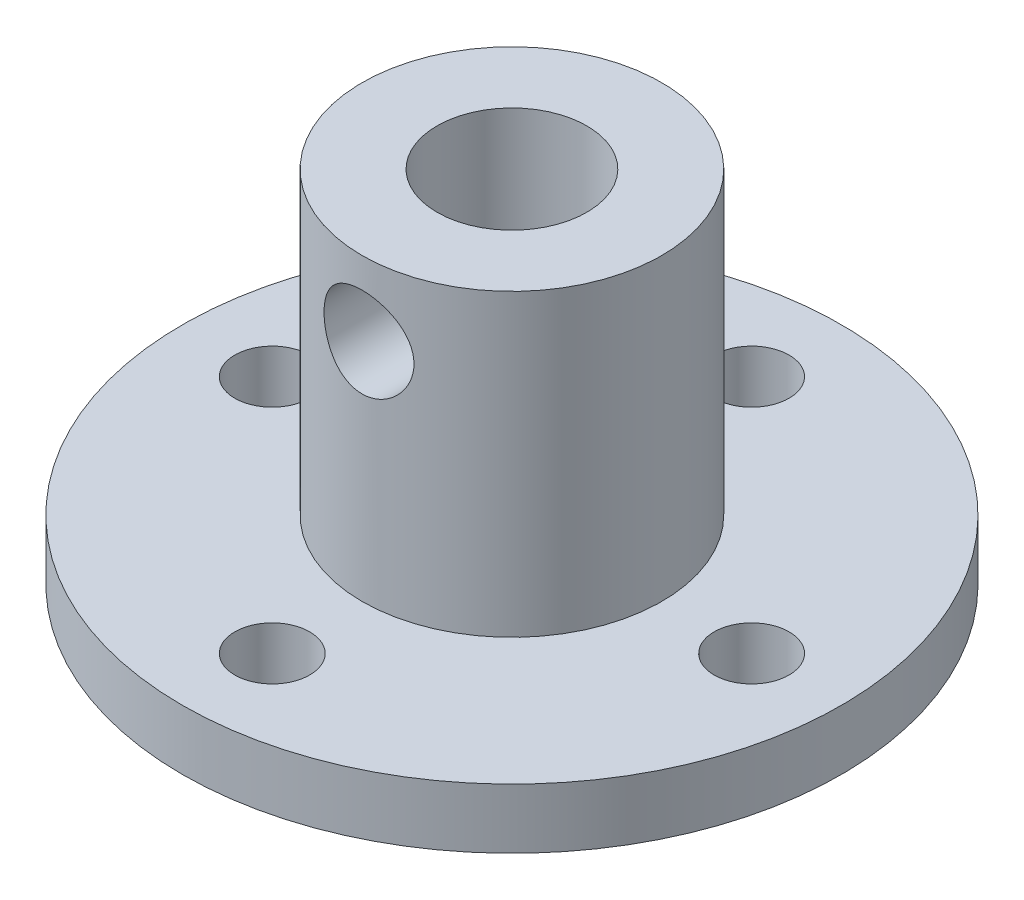
ISO-10303-21;
HEADER;
FILE_DESCRIPTION(('STEP AP214'),'2;1');
FILE_NAME('part.step','',(''),(''),'','','');
FILE_SCHEMA(('AUTOMOTIVE_DESIGN { 1 0 10303 214 1 1 1 1 }'));
ENDSEC;
DATA;
#1=APPLICATION_CONTEXT('core data for automotive mechanical design processes');
#2=APPLICATION_PROTOCOL_DEFINITION('international standard','automotive_design',2000,#1);
#3=PRODUCT_CONTEXT('',#1,'mechanical');
#4=PRODUCT('Part','Part','',(#3));
#5=PRODUCT_RELATED_PRODUCT_CATEGORY('part','',(#4));
#6=PRODUCT_DEFINITION_FORMATION('','',#4);
#7=PRODUCT_DEFINITION_CONTEXT('part definition',#1,'design');
#8=PRODUCT_DEFINITION('design','',#6,#7);
#9=PRODUCT_DEFINITION_SHAPE('','',#8);
#10=(LENGTH_UNIT() NAMED_UNIT(*) SI_UNIT(.MILLI.,.METRE.));
#11=(NAMED_UNIT(*) PLANE_ANGLE_UNIT() SI_UNIT($,.RADIAN.));
#12=(NAMED_UNIT(*) SI_UNIT($,.STERADIAN.) SOLID_ANGLE_UNIT());
#13=UNCERTAINTY_MEASURE_WITH_UNIT(LENGTH_MEASURE(1.E-05),#10,'distance_accuracy_value','');
#14=(GEOMETRIC_REPRESENTATION_CONTEXT(3) GLOBAL_UNCERTAINTY_ASSIGNED_CONTEXT((#13)) GLOBAL_UNIT_ASSIGNED_CONTEXT((#10,
#11,#12)) REPRESENTATION_CONTEXT('',''));
#15=CARTESIAN_POINT('',(0.,0.,0.));
#16=DIRECTION('',(0.,0.,1.));
#17=DIRECTION('',(1.,0.,0.));
#18=AXIS2_PLACEMENT_3D('',#15,#16,#17);
#19=CARTESIAN_POINT('',(0.,12.,0.));
#20=DIRECTION('',(0.,-1.,0.));
#21=DIRECTION('',(0.,0.,-1.));
#22=AXIS2_PLACEMENT_3D('',#19,#20,#21);
#23=CYLINDRICAL_SURFACE('',#22,5.);
#24=CARTESIAN_POINT('',(0.,12.,0.));
#25=DIRECTION('',(0.,1.,0.));
#26=DIRECTION('',(0.,0.,1.));
#27=AXIS2_PLACEMENT_3D('',#24,#25,#26);
#28=CIRCLE('',#27,5.);
#29=CARTESIAN_POINT('',(0.,12.,5.));
#30=VERTEX_POINT('',#29);
#31=EDGE_CURVE('E47',#30,#30,#28,.T.);
#32=ORIENTED_EDGE('',*,*,#31,.F.);
#33=EDGE_LOOP('',(#32));
#34=FACE_BOUND('',#33,.T.);
#35=CARTESIAN_POINT('',(0.,2.,0.));
#36=DIRECTION('',(0.,1.,0.));
#37=DIRECTION('',(0.,0.,1.));
#38=AXIS2_PLACEMENT_3D('',#35,#36,#37);
#39=CIRCLE('',#38,5.);
#40=CARTESIAN_POINT('',(0.,2.,5.));
#41=VERTEX_POINT('',#40);
#42=EDGE_CURVE('E10',#41,#41,#39,.T.);
#43=ORIENTED_EDGE('',*,*,#42,.T.);
#44=EDGE_LOOP('',(#43));
#45=FACE_BOUND('',#44,.T.);
#46=CARTESIAN_POINT('',(-1.5,9.5,4.76969600708473));
#47=CARTESIAN_POINT('',(-1.49999897633764,9.5821945479424,4.7696968572698));
#48=CARTESIAN_POINT('',(-1.49322108167142,9.66439922414402,4.77184390209069));
#49=CARTESIAN_POINT('',(-1.46635844446749,9.82640524959194,4.780165783029));
#50=CARTESIAN_POINT('',(-1.44626925573578,9.90620578650146,4.78634196493468));
#51=CARTESIAN_POINT('',(-1.39352753269955,10.0610347282717,4.80196102485633));
#52=CARTESIAN_POINT('',(-1.36089589394243,10.1360708296331,4.81139846703232));
#53=CARTESIAN_POINT('',(-1.28406421917929,10.2796219339953,4.83246932547567));
#54=CARTESIAN_POINT('',(-1.23986245137053,10.3481359586844,4.84410307041019));
#55=CARTESIAN_POINT('',(-1.13964754141627,10.4788663905774,4.86866862185765));
#56=CARTESIAN_POINT('',(-1.08333207175807,10.5408458979463,4.88162808311636));
#57=CARTESIAN_POINT('',(-0.961136237579599,10.6546379513225,4.90714861936757));
#58=CARTESIAN_POINT('',(-0.895254645461112,10.7064491904499,4.91970964297705));
#59=CARTESIAN_POINT('',(-0.75411143779369,10.7994626998333,4.94333214579389));
#60=CARTESIAN_POINT('',(-0.678684021335815,10.8404234244428,4.95435724342404));
#61=CARTESIAN_POINT('',(-0.521624645369354,10.9089872590428,4.97334435920684));
#62=CARTESIAN_POINT('',(-0.439994028387912,10.9365932498574,4.98130703789495));
#63=CARTESIAN_POINT('',(-0.27532385263083,10.9768800010905,4.99307646003589));
#64=CARTESIAN_POINT('',(-0.192391398953801,10.9899651276527,4.99699557369338));
#65=CARTESIAN_POINT('',(-0.0254218237493156,11.0021173246464,5.00063201501348));
#66=CARTESIAN_POINT('',(0.0586150620503676,11.001187339402,5.00035022521079));
#67=CARTESIAN_POINT('',(0.222571156600159,10.985607131457,4.99569603817658));
#68=CARTESIAN_POINT('',(0.30253626764134,10.9713948061901,4.9914542020526));
#69=CARTESIAN_POINT('',(0.458889213442526,10.9303686640057,4.97951522112593));
#70=CARTESIAN_POINT('',(0.535276821322845,10.9035540490573,4.97181785750586));
#71=CARTESIAN_POINT('',(0.68334732635128,10.8377879765814,4.95365220986963));
#72=CARTESIAN_POINT('',(0.754965064694478,10.7986987971927,4.94315269676706));
#73=CARTESIAN_POINT('',(0.890764673783155,10.7096021475718,4.92049640648069));
#74=CARTESIAN_POINT('',(0.95494477487213,10.6595920870365,4.90833923637778));
#75=CARTESIAN_POINT('',(1.0766604815298,10.5478022492484,4.88311550488166));
#76=CARTESIAN_POINT('',(1.13384458040111,10.4856430809703,4.87003195321461));
#77=CARTESIAN_POINT('',(1.23707651539824,10.35248998211,4.84483979887497));
#78=CARTESIAN_POINT('',(1.28312324482852,10.2814951746108,4.8327312931702));
#79=CARTESIAN_POINT('',(1.3631399533545,10.131760530751,4.81077903197678));
#80=CARTESIAN_POINT('',(1.39698989237679,10.0529529541371,4.80095810695957));
#81=CARTESIAN_POINT('',(1.45083362878413,9.89039279155446,4.78496392548436));
#82=CARTESIAN_POINT('',(1.4708319464056,9.80664182846544,4.7787894791583));
#83=CARTESIAN_POINT('',(1.49574770282165,9.63991763926072,4.77104849541241));
#84=CARTESIAN_POINT('',(1.50119946380212,9.55703177610602,4.7693187867044));
#85=CARTESIAN_POINT('',(1.49835947233062,9.39152709999014,4.77021192441924));
#86=CARTESIAN_POINT('',(1.4900696437133,9.30890825126915,4.77283416156589));
#87=CARTESIAN_POINT('',(1.4604576357419,9.14851162202913,4.78197558554912));
#88=CARTESIAN_POINT('',(1.4394796143128,9.07066383573648,4.78839176507489));
#89=CARTESIAN_POINT('',(1.3854857774794,8.91959830918509,4.80429141231227));
#90=CARTESIAN_POINT('',(1.3524681034276,8.84638128585943,4.81377535359073));
#91=CARTESIAN_POINT('',(1.27431871196501,8.70448253592787,4.83505835023047));
#92=CARTESIAN_POINT('',(1.22888564172729,8.63597527901421,4.84691271069798));
#93=CARTESIAN_POINT('',(1.12755301600385,8.5073618938192,4.87148205646987));
#94=CARTESIAN_POINT('',(1.07165095534897,8.44725778238721,4.88419724730003));
#95=CARTESIAN_POINT('',(0.9484551324936,8.33481959418526,4.90963633548158));
#96=CARTESIAN_POINT('',(0.880811065857436,8.28286437101302,4.92234245063004));
#97=CARTESIAN_POINT('',(0.737461784590251,8.19103329897225,4.94584851748651));
#98=CARTESIAN_POINT('',(0.661756970543946,8.15115685021854,4.95664856384717));
#99=CARTESIAN_POINT('',(0.504935504705224,8.08499996943171,4.97505970474957));
#100=CARTESIAN_POINT('',(0.423864622037841,8.05861798384102,4.98269453424966));
#101=CARTESIAN_POINT('',(0.258169966504591,8.01993908110958,4.99401979596827));
#102=CARTESIAN_POINT('',(0.173547217354765,8.00763813405158,4.9977113567088));
#103=CARTESIAN_POINT('',(0.00665215388274548,7.9977769559455,5.00066544081399));
#104=CARTESIAN_POINT('',(-0.0755851790862038,7.99966730459217,5.00009305111322));
#105=CARTESIAN_POINT('',(-0.238519481164401,8.01682163249912,4.99497264465037));
#106=CARTESIAN_POINT('',(-0.319216537346526,8.03208485348044,4.99042485330463));
#107=CARTESIAN_POINT('',(-0.475935813041356,8.07521166139962,4.97791168358327));
#108=CARTESIAN_POINT('',(-0.55199892735139,8.10293818064901,4.96998352900866));
#109=CARTESIAN_POINT('',(-0.698433237752051,8.17008191450719,4.9515294303945));
#110=CARTESIAN_POINT('',(-0.768803496050577,8.20950105028619,4.94100305949946));
#111=CARTESIAN_POINT('',(-0.904301892420562,8.30037345743003,4.91803965828228));
#112=CARTESIAN_POINT('',(-0.969190250076766,8.35217143000077,4.90555226923559));
#113=CARTESIAN_POINT('',(-1.08953757134594,8.4657103883328,4.88023537212334));
#114=CARTESIAN_POINT('',(-1.14499380960193,8.52745423789815,4.86740576641079));
#115=CARTESIAN_POINT('',(-1.24656269394549,8.6613407783105,4.84240680631319));
#116=CARTESIAN_POINT('',(-1.29234759757956,8.73373855339043,4.83026852693485));
#117=CARTESIAN_POINT('',(-1.37104313528775,8.88555517416102,4.80852547508793));
#118=CARTESIAN_POINT('',(-1.40395995557288,8.96497062360119,4.79891948596956));
#119=CARTESIAN_POINT('',(-1.45301942532949,9.11974043160627,4.78427816717595));
#120=CARTESIAN_POINT('',(-1.47058859011231,9.19460864693099,4.7788615484052));
#121=CARTESIAN_POINT('',(-1.49407818835144,9.34631522249577,4.77157042597167));
#122=CARTESIAN_POINT('',(-1.50000095706095,9.42315318464525,4.7696952122143));
#123=CARTESIAN_POINT('',(-1.5,9.5,4.76969600708473));
#124=B_SPLINE_CURVE_WITH_KNOTS('',3,(#46,#47,#48,#49,#50,#51,#52,#53,#54,#55,#56,#57,#58,#59,
#60,#61,#62,#63,#64,#65,#66,#67,#68,#69,#70,#71,#72,#73,#74,#75,#76,#77,#78,#79,#80,#81,#82,#83,
#84,#85,#86,#87,#88,#89,#90,#91,#92,#93,#94,#95,#96,#97,#98,#99,#100,#101,#102,#103,#104,#105,
#106,#107,#108,#109,#110,#111,#112,#113,#114,#115,#116,#117,#118,#119,#120,#121,#122,#123),
.UNSPECIFIED.,.T.,.F.,(4,2,2,2,2,2,2,2,2,2,2,2,2,2,2,2,2,2,2,2,2,2,2,2,2,2,2,2,2,2,2,2,2,2,2,2,
2,2,4),(0.,0.246300165915542,0.492682641688999,0.738656414466193,0.9846670253701,
1.23773150007984,1.49082847871273,1.74915939273644,2.00743455587877,2.25832140149558,
2.5091555410144,2.7520012599088,2.99486235890376,3.24055209335676,3.4863001659083,
3.74152147023278,3.99676812491863,4.25446238246266,4.51207250628411,4.76008080790309,
5.00805439107387,5.24958594938817,5.49115481045787,5.73920731809388,5.98731925928923,
6.24479506100602,6.50225807324202,6.75775391814325,7.01317662321682,7.2587630391122,
7.50433553047754,7.74727096872219,7.99024634491378,8.24099627054488,8.4918185262989,
8.75011639669147,9.00828993963944,9.23861153857447,9.4688869503356),.UNSPECIFIED.);
#125=CARTESIAN_POINT('',(-1.5,9.5,4.76969600708473));
#126=VERTEX_POINT('',#125);
#127=EDGE_CURVE('E151',#126,#126,#124,.T.);
#128=ORIENTED_EDGE('',*,*,#127,.T.);
#129=EDGE_LOOP('',(#128));
#130=FACE_BOUND('',#129,.T.);
#131=ADVANCED_FACE('F32',(#34,#45,#130),#23,.T.);
#132=CARTESIAN_POINT('',(0.,12.,0.));
#133=DIRECTION('',(0.,-1.,0.));
#134=DIRECTION('',(0.,0.,-1.));
#135=AXIS2_PLACEMENT_3D('',#132,#133,#134);
#136=CYLINDRICAL_SURFACE('',#135,2.5);
#137=CARTESIAN_POINT('',(0.,2.,0.));
#138=DIRECTION('',(0.,1.,0.));
#139=DIRECTION('',(0.,0.,1.));
#140=AXIS2_PLACEMENT_3D('',#137,#138,#139);
#141=CIRCLE('',#140,2.5);
#142=CARTESIAN_POINT('',(0.,2.,2.5));
#143=VERTEX_POINT('',#142);
#144=EDGE_CURVE('E145',#143,#143,#141,.T.);
#145=ORIENTED_EDGE('',*,*,#144,.F.);
#146=EDGE_LOOP('',(#145));
#147=FACE_BOUND('',#146,.T.);
#148=CARTESIAN_POINT('',(0.,12.,0.));
#149=DIRECTION('',(0.,1.,0.));
#150=DIRECTION('',(0.,0.,1.));
#151=AXIS2_PLACEMENT_3D('',#148,#149,#150);
#152=CIRCLE('',#151,2.5);
#153=CARTESIAN_POINT('',(0.,12.,2.5));
#154=VERTEX_POINT('',#153);
#155=EDGE_CURVE('E146',#154,#154,#152,.T.);
#156=ORIENTED_EDGE('',*,*,#155,.T.);
#157=EDGE_LOOP('',(#156));
#158=FACE_BOUND('',#157,.T.);
#159=CARTESIAN_POINT('',(-1.5,9.5,2.));
#160=CARTESIAN_POINT('',(-1.50000404108592,9.57547897528964,1.99999416642511));
#161=CARTESIAN_POINT('',(-1.49426852824013,9.6509384340798,2.00433633903481));
#162=CARTESIAN_POINT('',(-1.47174965152787,9.79932390396222,2.02092590613883));
#163=CARTESIAN_POINT('',(-1.45495475788936,9.8722471873851,2.03318155043097));
#164=CARTESIAN_POINT('',(-1.41143486335795,10.0130836416773,2.0636233903473));
#165=CARTESIAN_POINT('',(-1.3847815450315,10.0810288380353,2.0817666618312));
#166=CARTESIAN_POINT('',(-1.32252909283019,10.2114374533679,2.12185904995836));
#167=CARTESIAN_POINT('',(-1.28692729054693,10.2738992296951,2.14380930122416));
#168=CARTESIAN_POINT('',(-1.20271292747644,10.3999490166641,2.19228594587542));
#169=CARTESIAN_POINT('',(-1.15304179435289,10.4627409571239,2.21904371037662));
#170=CARTESIAN_POINT('',(-1.04426801309985,10.5797647627418,2.27226229431061));
#171=CARTESIAN_POINT('',(-0.985158296729612,10.6339901516708,2.29872287517103));
#172=CARTESIAN_POINT('',(-0.851442367411701,10.7381338097097,2.35175567858734));
#173=CARTESIAN_POINT('',(-0.775851995162547,10.7869544636698,2.37803133577818));
#174=CARTESIAN_POINT('',(-0.615654228271657,10.8708097224444,2.42443786983179));
#175=CARTESIAN_POINT('',(-0.531055196626329,10.9058569741227,2.44457437988735));
#176=CARTESIAN_POINT('',(-0.363771406742664,10.9575959228126,2.4747098780044));
#177=CARTESIAN_POINT('',(-0.281674698130913,10.9757203609673,2.4854930393917));
#178=CARTESIAN_POINT('',(-0.114970509382706,10.9979428028631,2.49874939277545));
#179=CARTESIAN_POINT('',(-0.0303654624001517,11.0020539780001,2.50123038813308));
#180=CARTESIAN_POINT('',(0.127637283737311,10.9963862526575,2.49783372711539));
#181=CARTESIAN_POINT('',(0.201123832865636,10.9882664738307,2.49295437513726));
#182=CARTESIAN_POINT('',(0.345464269151769,10.9615202043519,2.47707997553857));
#183=CARTESIAN_POINT('',(0.416317961051203,10.9428929360928,2.46608447529309));
#184=CARTESIAN_POINT('',(0.554056780469081,10.8958344372962,2.43884907201719));
#185=CARTESIAN_POINT('',(0.620916491037619,10.867346938861,2.42257910450824));
#186=CARTESIAN_POINT('',(0.748988660115612,10.8016153837745,2.38609637638748));
#187=CARTESIAN_POINT('',(0.810199646208012,10.764369052941,2.36588259201812));
#188=CARTESIAN_POINT('',(0.9330742671432,10.6771609071955,2.32037925976363));
#189=CARTESIAN_POINT('',(0.993918663198194,10.6262116882643,2.2947718295215));
#190=CARTESIAN_POINT('',(1.10671465909275,10.5155958821398,2.24255554245601));
#191=CARTESIAN_POINT('',(1.1586540130834,10.4559174965255,2.21594536703375));
#192=CARTESIAN_POINT('',(1.25824837767417,10.3213465938364,2.16111075123946));
#193=CARTESIAN_POINT('',(1.30470933188632,10.2454924234605,2.13305661385124));
#194=CARTESIAN_POINT('',(1.38397217194232,10.0852937683634,2.08250879557267));
#195=CARTESIAN_POINT('',(1.41679921962189,10.0009652838744,2.0600049029882));
#196=CARTESIAN_POINT('',(1.46077497064843,9.84760636810465,2.02895865196731));
#197=CARTESIAN_POINT('',(1.47527903312665,9.77995936770336,2.01833888618315));
#198=CARTESIAN_POINT('',(1.49480872755284,9.64262638970052,2.00392150777558));
#199=CARTESIAN_POINT('',(1.49984538302907,9.57294287951544,2.00011596115116));
#200=CARTESIAN_POINT('',(1.50014781114183,9.4334483175643,1.99988914321323));
#201=CARTESIAN_POINT('',(1.49540004697659,9.36363722278479,2.00347810223984));
#202=CARTESIAN_POINT('',(1.47640290574941,9.22601265625144,2.01751520788652));
#203=CARTESIAN_POINT('',(1.4621460183014,9.15820080775975,2.02796877613213));
#204=CARTESIAN_POINT('',(1.42488312618657,9.02628542052021,2.054317683331));
#205=CARTESIAN_POINT('',(1.40188805257362,8.96217736346777,2.07020622092812));
#206=CARTESIAN_POINT('',(1.34796261057072,8.83852228426982,2.10571539417587));
#207=CARTESIAN_POINT('',(1.31702924888212,8.778976993634,2.12533743689999));
#208=CARTESIAN_POINT('',(1.24167439558512,8.65475991748776,2.17036819177737));
#209=CARTESIAN_POINT('',(1.19582663060303,8.59109916490343,2.19618239397369));
#210=CARTESIAN_POINT('',(1.09487395518701,8.47171451515054,2.2482175480362));
#211=CARTESIAN_POINT('',(1.03976018672402,8.41599830783088,2.27443886711455));
#212=CARTESIAN_POINT('',(0.91327483721277,8.30677599264957,2.32835625910913));
#213=CARTESIAN_POINT('',(0.840721108780195,8.25449927339416,2.3558007587587));
#214=CARTESIAN_POINT('',(0.686103100868024,8.16309722316335,2.40537639133459));
#215=CARTESIAN_POINT('',(0.604045176134707,8.12396317215908,2.4275110444941));
#216=CARTESIAN_POINT('',(0.438840232972143,8.06313179656864,2.46252280092775));
#217=CARTESIAN_POINT('',(0.356205963651263,8.04037377220889,2.47595588067329));
#218=CARTESIAN_POINT('',(0.187383063890862,8.00928539715374,2.494407389061));
#219=CARTESIAN_POINT('',(0.101198571781973,8.00093870928238,2.49943534582737));
#220=CARTESIAN_POINT('',(-0.0598120232009799,7.99932539141407,2.50040600461976));
#221=CARTESIAN_POINT('',(-0.134620583589702,8.00419666543697,2.49747057186327));
#222=CARTESIAN_POINT('',(-0.28214875597877,8.02489382438161,2.48512948412096));
#223=CARTESIAN_POINT('',(-0.35486834470191,8.0407198313216,2.47572375706639));
#224=CARTESIAN_POINT('',(-0.495145481978793,8.08221957158378,2.45149427526962));
#225=CARTESIAN_POINT('',(-0.562767032608826,8.10773159612924,2.43675966858906));
#226=CARTESIAN_POINT('',(-0.69278197199998,8.16764059455475,2.40303337447155));
#227=CARTESIAN_POINT('',(-0.755174184199829,8.2020395608596,2.38404073252268));
#228=CARTESIAN_POINT('',(-0.880263645295944,8.28292519656875,2.34093432659381));
#229=CARTESIAN_POINT('',(-0.942258690439936,8.33031870901686,2.31648844639149));
#230=CARTESIAN_POINT('',(-1.05789751536306,8.43375303371772,2.26601907350661));
#231=CARTESIAN_POINT('',(-1.11153190956915,8.4898034256079,2.23999385274509));
#232=CARTESIAN_POINT('',(-1.2159097535057,8.61728556217769,2.18528165666205));
#233=CARTESIAN_POINT('',(-1.26542406663367,8.68976648616549,2.15667566270901));
#234=CARTESIAN_POINT('',(-1.35156817210325,8.84348485276654,2.10376464485145));
#235=CARTESIAN_POINT('',(-1.38820466322661,8.92471771398141,2.07945738811052));
#236=CARTESIAN_POINT('',(-1.44437116535132,9.0870642851372,2.0408000304796));
#237=CARTESIAN_POINT('',(-1.46509526060187,9.16759523596124,2.02577665830138));
#238=CARTESIAN_POINT('',(-1.49289268240426,9.33209739470368,2.00539032320036));
#239=CARTESIAN_POINT('',(-1.49999550595837,9.41606076575871,2.00000648744643));
#240=CARTESIAN_POINT('',(-1.5,9.5,2.));
#241=B_SPLINE_CURVE_WITH_KNOTS('',3,(#159,#160,#161,#162,#163,#164,#165,#166,#167,#168,#169,
#170,#171,#172,#173,#174,#175,#176,#177,#178,#179,#180,#181,#182,#183,#184,#185,#186,#187,#188,
#189,#190,#191,#192,#193,#194,#195,#196,#197,#198,#199,#200,#201,#202,#203,#204,#205,#206,#207,
#208,#209,#210,#211,#212,#213,#214,#215,#216,#217,#218,#219,#220,#221,#222,#223,#224,#225,#226,
#227,#228,#229,#230,#231,#232,#233,#234,#235,#236,#237,#238,#239,#240),.UNSPECIFIED.,.T.,.F.,(4,
2,2,2,2,2,2,2,2,2,2,2,2,2,2,2,2,2,2,2,2,2,2,2,2,2,2,2,2,2,2,2,2,2,2,2,2,2,2,2,4),(0.,
0.226085249493392,0.452406574330771,0.677113624991878,0.901887762215932,1.15414462390001,
1.40659128601844,1.68630157736223,1.9657544327122,2.21853330858497,2.47107452602767,
2.69230130543182,2.91354445887945,3.13607155036377,3.35865648368878,3.60782810055849,
3.85733966656908,4.13576671140276,4.41367760154768,4.62276298054684,4.83160475643976,
5.04073566011181,5.25003193304128,5.45906724365495,5.6681814915466,5.91499438482002,
6.16204457978454,6.44121828011588,6.72020638384847,6.97891479383337,7.23732973022726,
7.46129321849399,7.68525920139648,7.90563970188756,8.12606965394584,8.37042963549487,
8.61506198741954,8.89071695766603,9.16622832484805,9.41820120134354,9.66962780912277),.UNSPECIFIED.);
#242=CARTESIAN_POINT('',(-1.5,9.5,2.));
#243=VERTEX_POINT('',#242);
#244=EDGE_CURVE('E147',#243,#243,#241,.T.);
#245=ORIENTED_EDGE('',*,*,#244,.F.);
#246=EDGE_LOOP('',(#245));
#247=FACE_BOUND('',#246,.T.);
#248=ADVANCED_FACE('F92',(#147,#158,#247),#136,.F.);
#249=CARTESIAN_POINT('',(0.,2.,0.));
#250=DIRECTION('',(0.,1.,0.));
#251=DIRECTION('',(0.,0.,1.));
#252=AXIS2_PLACEMENT_3D('',#249,#250,#251);
#253=PLANE('',#252);
#254=ORIENTED_EDGE('',*,*,#42,.F.);
#255=EDGE_LOOP('',(#254));
#256=FACE_BOUND('',#255,.T.);
#257=CARTESIAN_POINT('',(0.,2.,8.));
#258=DIRECTION('',(0.,1.,0.));
#259=DIRECTION('',(0.,0.,1.));
#260=AXIS2_PLACEMENT_3D('',#257,#258,#259);
#261=CIRCLE('',#260,1.25);
#262=CARTESIAN_POINT('',(0.,2.,9.25));
#263=VERTEX_POINT('',#262);
#264=EDGE_CURVE('E56',#263,#263,#261,.T.);
#265=ORIENTED_EDGE('',*,*,#264,.F.);
#266=EDGE_LOOP('',(#265));
#267=FACE_BOUND('',#266,.T.);
#268=CARTESIAN_POINT('',(0.,2.,-8.));
#269=DIRECTION('',(0.,1.,0.));
#270=DIRECTION('',(0.,0.,1.));
#271=AXIS2_PLACEMENT_3D('',#268,#269,#270);
#272=CIRCLE('',#271,1.25);
#273=CARTESIAN_POINT('',(0.,2.,-6.75));
#274=VERTEX_POINT('',#273);
#275=EDGE_CURVE('E68',#274,#274,#272,.T.);
#276=ORIENTED_EDGE('',*,*,#275,.F.);
#277=EDGE_LOOP('',(#276));
#278=FACE_BOUND('',#277,.T.);
#279=CARTESIAN_POINT('',(0.,2.,0.));
#280=DIRECTION('',(0.,1.,0.));
#281=DIRECTION('',(0.,0.,1.));
#282=AXIS2_PLACEMENT_3D('',#279,#280,#281);
#283=CIRCLE('',#282,11.);
#284=CARTESIAN_POINT('',(0.,2.,11.));
#285=VERTEX_POINT('',#284);
#286=EDGE_CURVE('E40',#285,#285,#283,.T.);
#287=ORIENTED_EDGE('',*,*,#286,.T.);
#288=EDGE_LOOP('',(#287));
#289=FACE_BOUND('',#288,.T.);
#290=CARTESIAN_POINT('',(8.,2.,0.));
#291=DIRECTION('',(0.,1.,0.));
#292=DIRECTION('',(0.,0.,1.));
#293=AXIS2_PLACEMENT_3D('',#290,#291,#292);
#294=CIRCLE('',#293,1.25);
#295=CARTESIAN_POINT('',(8.,2.,1.25000000000003));
#296=VERTEX_POINT('',#295);
#297=EDGE_CURVE('E62',#296,#296,#294,.T.);
#298=ORIENTED_EDGE('',*,*,#297,.F.);
#299=EDGE_LOOP('',(#298));
#300=FACE_BOUND('',#299,.T.);
#301=CARTESIAN_POINT('',(-8.,2.,0.));
#302=DIRECTION('',(0.,1.,0.));
#303=DIRECTION('',(0.,0.,1.));
#304=AXIS2_PLACEMENT_3D('',#301,#302,#303);
#305=CIRCLE('',#304,1.25);
#306=CARTESIAN_POINT('',(-8.,2.,1.24999999999992));
#307=VERTEX_POINT('',#306);
#308=EDGE_CURVE('E49',#307,#307,#305,.T.);
#309=ORIENTED_EDGE('',*,*,#308,.F.);
#310=EDGE_LOOP('',(#309));
#311=FACE_BOUND('',#310,.T.);
#312=ADVANCED_FACE('F98',(#256,#267,#278,#289,#300,#311),#253,.T.);
#313=CARTESIAN_POINT('',(0.,0.,0.));
#314=DIRECTION('',(0.,1.,0.));
#315=DIRECTION('',(0.,0.,1.));
#316=AXIS2_PLACEMENT_3D('',#313,#314,#315);
#317=PLANE('',#316);
#318=CARTESIAN_POINT('',(0.,0.,0.));
#319=DIRECTION('',(0.,1.,0.));
#320=DIRECTION('',(0.,0.,1.));
#321=AXIS2_PLACEMENT_3D('',#318,#319,#320);
#322=CIRCLE('',#321,11.);
#323=CARTESIAN_POINT('',(0.,0.,11.));
#324=VERTEX_POINT('',#323);
#325=EDGE_CURVE('E36',#324,#324,#322,.T.);
#326=ORIENTED_EDGE('',*,*,#325,.F.);
#327=EDGE_LOOP('',(#326));
#328=FACE_BOUND('',#327,.T.);
#329=CARTESIAN_POINT('',(0.,0.,-8.));
#330=DIRECTION('',(0.,1.,0.));
#331=DIRECTION('',(0.,0.,1.));
#332=AXIS2_PLACEMENT_3D('',#329,#330,#331);
#333=CIRCLE('',#332,1.25);
#334=CARTESIAN_POINT('',(0.,0.,-6.75));
#335=VERTEX_POINT('',#334);
#336=EDGE_CURVE('E65',#335,#335,#333,.T.);
#337=ORIENTED_EDGE('',*,*,#336,.T.);
#338=EDGE_LOOP('',(#337));
#339=FACE_BOUND('',#338,.T.);
#340=CARTESIAN_POINT('',(8.,0.,0.));
#341=DIRECTION('',(0.,1.,0.));
#342=DIRECTION('',(0.,0.,1.));
#343=AXIS2_PLACEMENT_3D('',#340,#341,#342);
#344=CIRCLE('',#343,1.25);
#345=CARTESIAN_POINT('',(8.,0.,1.25000000000003));
#346=VERTEX_POINT('',#345);
#347=EDGE_CURVE('E59',#346,#346,#344,.T.);
#348=ORIENTED_EDGE('',*,*,#347,.T.);
#349=EDGE_LOOP('',(#348));
#350=FACE_BOUND('',#349,.T.);
#351=CARTESIAN_POINT('',(0.,0.,8.));
#352=DIRECTION('',(0.,1.,0.));
#353=DIRECTION('',(0.,0.,1.));
#354=AXIS2_PLACEMENT_3D('',#351,#352,#353);
#355=CIRCLE('',#354,1.25);
#356=CARTESIAN_POINT('',(0.,0.,9.25));
#357=VERTEX_POINT('',#356);
#358=EDGE_CURVE('E52',#357,#357,#355,.T.);
#359=ORIENTED_EDGE('',*,*,#358,.T.);
#360=EDGE_LOOP('',(#359));
#361=FACE_BOUND('',#360,.T.);
#362=CARTESIAN_POINT('',(-8.,0.,0.));
#363=DIRECTION('',(0.,1.,0.));
#364=DIRECTION('',(0.,0.,1.));
#365=AXIS2_PLACEMENT_3D('',#362,#363,#364);
#366=CIRCLE('',#365,1.25);
#367=CARTESIAN_POINT('',(-8.,0.,1.24999999999992));
#368=VERTEX_POINT('',#367);
#369=EDGE_CURVE('E53',#368,#368,#366,.T.);
#370=ORIENTED_EDGE('',*,*,#369,.T.);
#371=EDGE_LOOP('',(#370));
#372=FACE_BOUND('',#371,.T.);
#373=ADVANCED_FACE('F74',(#328,#339,#350,#361,#372),#317,.F.);
#374=CARTESIAN_POINT('',(0.,2.,0.));
#375=DIRECTION('',(0.,-1.,0.));
#376=DIRECTION('',(0.,0.,-1.));
#377=AXIS2_PLACEMENT_3D('',#374,#375,#376);
#378=CYLINDRICAL_SURFACE('',#377,11.);
#379=ORIENTED_EDGE('',*,*,#286,.F.);
#380=EDGE_LOOP('',(#379));
#381=FACE_BOUND('',#380,.T.);
#382=ORIENTED_EDGE('',*,*,#325,.T.);
#383=EDGE_LOOP('',(#382));
#384=FACE_BOUND('',#383,.T.);
#385=ADVANCED_FACE('F34',(#381,#384),#378,.T.);
#386=CARTESIAN_POINT('',(0.,2.,-8.));
#387=DIRECTION('',(0.,-1.,0.));
#388=DIRECTION('',(0.,0.,-1.));
#389=AXIS2_PLACEMENT_3D('',#386,#387,#388);
#390=CYLINDRICAL_SURFACE('',#389,1.25);
#391=ORIENTED_EDGE('',*,*,#275,.T.);
#392=EDGE_LOOP('',(#391));
#393=FACE_BOUND('',#392,.T.);
#394=ORIENTED_EDGE('',*,*,#336,.F.);
#395=EDGE_LOOP('',(#394));
#396=FACE_BOUND('',#395,.T.);
#397=ADVANCED_FACE('F77',(#393,#396),#390,.F.);
#398=CARTESIAN_POINT('',(8.,2.,0.));
#399=DIRECTION('',(0.,-1.,0.));
#400=DIRECTION('',(0.,0.,-1.));
#401=AXIS2_PLACEMENT_3D('',#398,#399,#400);
#402=CYLINDRICAL_SURFACE('',#401,1.25);
#403=ORIENTED_EDGE('',*,*,#297,.T.);
#404=EDGE_LOOP('',(#403));
#405=FACE_BOUND('',#404,.T.);
#406=ORIENTED_EDGE('',*,*,#347,.F.);
#407=EDGE_LOOP('',(#406));
#408=FACE_BOUND('',#407,.T.);
#409=ADVANCED_FACE('F79',(#405,#408),#402,.F.);
#410=CARTESIAN_POINT('',(0.,2.,8.));
#411=DIRECTION('',(0.,-1.,0.));
#412=DIRECTION('',(0.,0.,-1.));
#413=AXIS2_PLACEMENT_3D('',#410,#411,#412);
#414=CYLINDRICAL_SURFACE('',#413,1.25);
#415=ORIENTED_EDGE('',*,*,#264,.T.);
#416=EDGE_LOOP('',(#415));
#417=FACE_BOUND('',#416,.T.);
#418=ORIENTED_EDGE('',*,*,#358,.F.);
#419=EDGE_LOOP('',(#418));
#420=FACE_BOUND('',#419,.T.);
#421=ADVANCED_FACE('F86',(#417,#420),#414,.F.);
#422=CARTESIAN_POINT('',(-8.,2.,0.));
#423=DIRECTION('',(0.,-1.,0.));
#424=DIRECTION('',(0.,0.,-1.));
#425=AXIS2_PLACEMENT_3D('',#422,#423,#424);
#426=CYLINDRICAL_SURFACE('',#425,1.25);
#427=ORIENTED_EDGE('',*,*,#308,.T.);
#428=EDGE_LOOP('',(#427));
#429=FACE_BOUND('',#428,.T.);
#430=ORIENTED_EDGE('',*,*,#369,.F.);
#431=EDGE_LOOP('',(#430));
#432=FACE_BOUND('',#431,.T.);
#433=ADVANCED_FACE('F105',(#429,#432),#426,.F.);
#434=CARTESIAN_POINT('',(0.,12.,0.));
#435=DIRECTION('',(0.,1.,0.));
#436=DIRECTION('',(0.,0.,1.));
#437=AXIS2_PLACEMENT_3D('',#434,#435,#436);
#438=PLANE('',#437);
#439=ORIENTED_EDGE('',*,*,#31,.T.);
#440=EDGE_LOOP('',(#439));
#441=FACE_BOUND('',#440,.T.);
#442=ORIENTED_EDGE('',*,*,#155,.F.);
#443=EDGE_LOOP('',(#442));
#444=FACE_BOUND('',#443,.T.);
#445=ADVANCED_FACE('F104',(#441,#444),#438,.T.);
#446=ORIENTED_EDGE('',*,*,#144,.T.);
#447=EDGE_LOOP('',(#446));
#448=FACE_BOUND('',#447,.T.);
#449=ADVANCED_FACE('F126',(#448),#253,.T.);
#450=CARTESIAN_POINT('',(0.,9.5,11.001));
#451=DIRECTION('',(0.,0.,-1.));
#452=DIRECTION('',(-1.,0.,0.));
#453=AXIS2_PLACEMENT_3D('',#450,#451,#452);
#454=CYLINDRICAL_SURFACE('',#453,1.5);
#455=ORIENTED_EDGE('',*,*,#244,.T.);
#456=EDGE_LOOP('',(#455));
#457=FACE_BOUND('',#456,.T.);
#458=ORIENTED_EDGE('',*,*,#127,.F.);
#459=EDGE_LOOP('',(#458));
#460=FACE_BOUND('',#459,.T.);
#461=ADVANCED_FACE('F134',(#457,#460),#454,.F.);
#462=CLOSED_SHELL('',(#131,#248,#312,#373,#385,#397,#409,#421,#433,#445,#449,#461));
#463=MANIFOLD_SOLID_BREP('B2',#462);
#464=ADVANCED_BREP_SHAPE_REPRESENTATION('',(#18,#463),#14);
#465=SHAPE_DEFINITION_REPRESENTATION(#9,#464);
ENDSEC;
END-ISO-10303-21;
